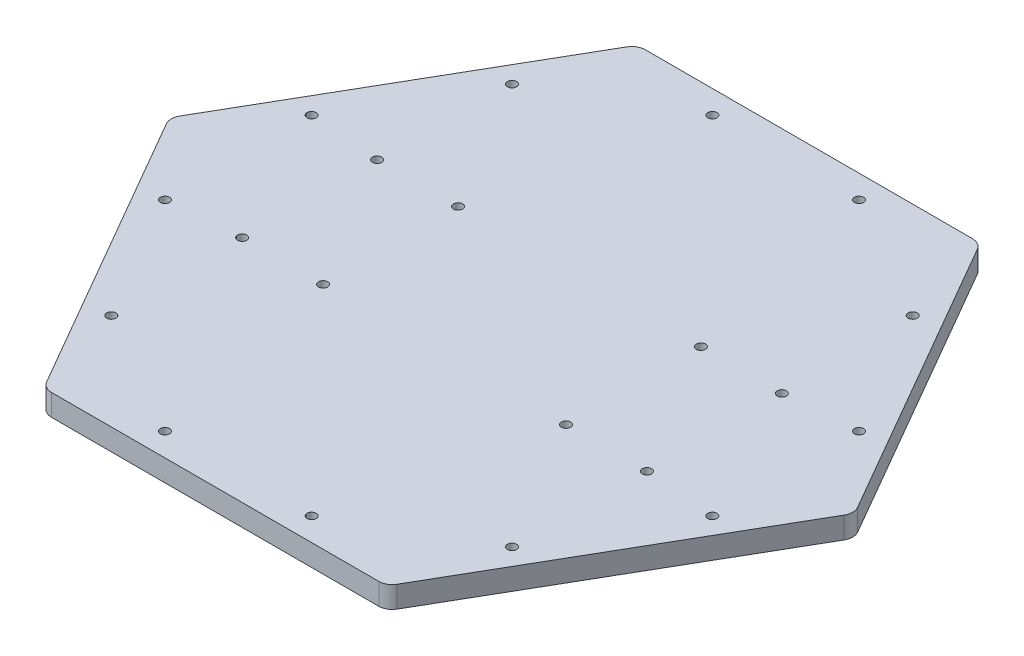
ISO-10303-21;
HEADER;
FILE_DESCRIPTION(('STEP AP214'),'2;1');
FILE_NAME('part.step','',(''),(''),'','','');
FILE_SCHEMA(('AUTOMOTIVE_DESIGN { 1 0 10303 214 1 1 1 1 }'));
ENDSEC;
DATA;
#1=APPLICATION_CONTEXT('core data for automotive mechanical design processes');
#2=APPLICATION_PROTOCOL_DEFINITION('international standard','automotive_design',2000,#1);
#3=PRODUCT_CONTEXT('',#1,'mechanical');
#4=PRODUCT('Part','Part','',(#3));
#5=PRODUCT_RELATED_PRODUCT_CATEGORY('part','',(#4));
#6=PRODUCT_DEFINITION_FORMATION('','',#4);
#7=PRODUCT_DEFINITION_CONTEXT('part definition',#1,'design');
#8=PRODUCT_DEFINITION('design','',#6,#7);
#9=PRODUCT_DEFINITION_SHAPE('','',#8);
#10=(LENGTH_UNIT() NAMED_UNIT(*) SI_UNIT(.MILLI.,.METRE.));
#11=(NAMED_UNIT(*) PLANE_ANGLE_UNIT() SI_UNIT($,.RADIAN.));
#12=(NAMED_UNIT(*) SI_UNIT($,.STERADIAN.) SOLID_ANGLE_UNIT());
#13=UNCERTAINTY_MEASURE_WITH_UNIT(LENGTH_MEASURE(1.E-05),#10,'distance_accuracy_value','');
#14=(GEOMETRIC_REPRESENTATION_CONTEXT(3) GLOBAL_UNCERTAINTY_ASSIGNED_CONTEXT((#13)) GLOBAL_UNIT_ASSIGNED_CONTEXT((#10,
#11,#12)) REPRESENTATION_CONTEXT('',''));
#15=CARTESIAN_POINT('',(0.,0.,0.));
#16=DIRECTION('',(0.,0.,1.));
#17=DIRECTION('',(1.,0.,0.));
#18=AXIS2_PLACEMENT_3D('',#15,#16,#17);
#19=CARTESIAN_POINT('',(63.5085296108598,-8.,109.999999999999));
#20=DIRECTION('',(0.866025403784442,0.,0.499999999999995));
#21=DIRECTION('',(0.499999999999995,0.,-0.866025403784442));
#22=AXIS2_PLACEMENT_3D('',#19,#20,#21);
#23=PLANE('',#22);
#24=DIRECTION('',(0.499999999999995,0.,-0.866025403784442));
#25=VECTOR('',#24,1.);
#26=CARTESIAN_POINT('',(63.5085296108598,-8.,109.999999999999));
#27=LINE('',#26,#25);
#28=CARTESIAN_POINT('',(64.9519052838338,-8.,107.499999999999));
#29=VERTEX_POINT('',#28);
#30=CARTESIAN_POINT('',(125.573683548743,-8.,2.49999999999996));
#31=VERTEX_POINT('',#30);
#32=EDGE_CURVE('E222',#29,#31,#27,.T.);
#33=ORIENTED_EDGE('',*,*,#32,.T.);
#34=DIRECTION('',(0.,1.,0.));
#35=VECTOR('',#34,1.);
#36=CARTESIAN_POINT('',(125.573683548743,-8.,2.49999999999996));
#37=LINE('',#36,#35);
#38=CARTESIAN_POINT('',(125.573683548743,0.,2.49999999999996));
#39=VERTEX_POINT('',#38);
#40=EDGE_CURVE('E143',#31,#39,#37,.T.);
#41=ORIENTED_EDGE('',*,*,#40,.T.);
#42=DIRECTION('',(0.499999999999995,0.,-0.866025403784442));
#43=VECTOR('',#42,1.);
#44=CARTESIAN_POINT('',(63.5085296108598,0.,109.999999999999));
#45=LINE('',#44,#43);
#46=CARTESIAN_POINT('',(64.9519052838338,0.,107.499999999999));
#47=VERTEX_POINT('',#46);
#48=EDGE_CURVE('E135',#47,#39,#45,.T.);
#49=ORIENTED_EDGE('',*,*,#48,.F.);
#50=DIRECTION('',(0.,1.,0.));
#51=VECTOR('',#50,1.);
#52=CARTESIAN_POINT('',(64.9519052838338,-8.,107.499999999999));
#53=LINE('',#52,#51);
#54=EDGE_CURVE('E148',#47,#29,#53,.F.);
#55=ORIENTED_EDGE('',*,*,#54,.T.);
#56=EDGE_LOOP('',(#33,#41,#49,#55));
#57=FACE_BOUND('',#56,.T.);
#58=ADVANCED_FACE('F42',(#57),#23,.T.);
#59=CARTESIAN_POINT('',(-63.5085296108575,-8.,110.));
#60=DIRECTION('',(0.,0.,1.));
#61=DIRECTION('',(1.,0.,0.));
#62=AXIS2_PLACEMENT_3D('',#59,#60,#61);
#63=PLANE('',#62);
#64=DIRECTION('',(1.,0.,0.));
#65=VECTOR('',#64,1.);
#66=CARTESIAN_POINT('',(-63.5085296108575,0.,110.));
#67=LINE('',#66,#65);
#68=CARTESIAN_POINT('',(-60.6217782649093,0.,110.));
#69=VERTEX_POINT('',#68);
#70=CARTESIAN_POINT('',(60.6217782649117,0.,109.999999999999));
#71=VERTEX_POINT('',#70);
#72=EDGE_CURVE('E137',#69,#71,#67,.T.);
#73=ORIENTED_EDGE('',*,*,#72,.F.);
#74=DIRECTION('',(0.,1.,0.));
#75=VECTOR('',#74,1.);
#76=CARTESIAN_POINT('',(-60.6217782649093,-8.,110.));
#77=LINE('',#76,#75);
#78=CARTESIAN_POINT('',(-60.6217782649093,-8.,110.));
#79=VERTEX_POINT('',#78);
#80=EDGE_CURVE('E11',#69,#79,#77,.F.);
#81=ORIENTED_EDGE('',*,*,#80,.T.);
#82=DIRECTION('',(1.,0.,0.));
#83=VECTOR('',#82,1.);
#84=CARTESIAN_POINT('',(-63.5085296108575,-8.,110.));
#85=LINE('',#84,#83);
#86=CARTESIAN_POINT('',(60.6217782649117,-8.,109.999999999999));
#87=VERTEX_POINT('',#86);
#88=EDGE_CURVE('E156',#79,#87,#85,.T.);
#89=ORIENTED_EDGE('',*,*,#88,.T.);
#90=DIRECTION('',(0.,1.,0.));
#91=VECTOR('',#90,1.);
#92=CARTESIAN_POINT('',(60.6217782649117,-8.,109.999999999999));
#93=LINE('',#92,#91);
#94=EDGE_CURVE('E50',#87,#71,#93,.T.);
#95=ORIENTED_EDGE('',*,*,#94,.T.);
#96=EDGE_LOOP('',(#73,#81,#89,#95));
#97=FACE_BOUND('',#96,.T.);
#98=ADVANCED_FACE('F203',(#97),#63,.T.);
#99=CARTESIAN_POINT('',(-127.017059221717,-8.,8.86955383974716E-13));
#100=DIRECTION('',(-0.866025403784435,0.,0.500000000000007));
#101=DIRECTION('',(0.500000000000007,0.,0.866025403784434));
#102=AXIS2_PLACEMENT_3D('',#99,#100,#101);
#103=PLANE('',#102);
#104=DIRECTION('',(0.500000000000007,0.,0.866025403784435));
#105=VECTOR('',#104,1.);
#106=CARTESIAN_POINT('',(-127.017059221717,0.,8.86955383974716E-13));
#107=LINE('',#106,#105);
#108=CARTESIAN_POINT('',(-125.573683548743,0.,2.50000000000088));
#109=VERTEX_POINT('',#108);
#110=CARTESIAN_POINT('',(-64.9519052838316,0.,107.5));
#111=VERTEX_POINT('',#110);
#112=EDGE_CURVE('E218',#109,#111,#107,.T.);
#113=ORIENTED_EDGE('',*,*,#112,.F.);
#114=DIRECTION('',(0.,1.,0.));
#115=VECTOR('',#114,1.);
#116=CARTESIAN_POINT('',(-125.573683548743,-8.,2.50000000000088));
#117=LINE('',#116,#115);
#118=CARTESIAN_POINT('',(-125.573683548743,-8.,2.50000000000088));
#119=VERTEX_POINT('',#118);
#120=EDGE_CURVE('E201',#109,#119,#117,.F.);
#121=ORIENTED_EDGE('',*,*,#120,.T.);
#122=DIRECTION('',(0.500000000000007,0.,0.866025403784435));
#123=VECTOR('',#122,1.);
#124=CARTESIAN_POINT('',(-127.017059221717,-8.,8.86955383974716E-13));
#125=LINE('',#124,#123);
#126=CARTESIAN_POINT('',(-64.9519052838316,-8.,107.5));
#127=VERTEX_POINT('',#126);
#128=EDGE_CURVE('E160',#119,#127,#125,.T.);
#129=ORIENTED_EDGE('',*,*,#128,.T.);
#130=DIRECTION('',(0.,1.,0.));
#131=VECTOR('',#130,1.);
#132=CARTESIAN_POINT('',(-64.9519052838316,-8.,107.5));
#133=LINE('',#132,#131);
#134=EDGE_CURVE('E198',#127,#111,#133,.T.);
#135=ORIENTED_EDGE('',*,*,#134,.T.);
#136=EDGE_LOOP('',(#113,#121,#129,#135));
#137=FACE_BOUND('',#136,.T.);
#138=ADVANCED_FACE('F217',(#137),#103,.T.);
#139=CARTESIAN_POINT('',(-63.508529610859,-8.,-109.999999999999));
#140=DIRECTION('',(-0.866025403784442,0.,-0.499999999999995));
#141=DIRECTION('',(-0.499999999999995,0.,0.866025403784442));
#142=AXIS2_PLACEMENT_3D('',#139,#140,#141);
#143=PLANE('',#142);
#144=DIRECTION('',(-0.499999999999995,0.,0.866025403784442));
#145=VECTOR('',#144,1.);
#146=CARTESIAN_POINT('',(-63.508529610859,0.,-109.999999999999));
#147=LINE('',#146,#145);
#148=CARTESIAN_POINT('',(-64.9519052838331,0.,-107.499999999999));
#149=VERTEX_POINT('',#148);
#150=CARTESIAN_POINT('',(-125.573683548743,0.,-2.49999999999911));
#151=VERTEX_POINT('',#150);
#152=EDGE_CURVE('E221',#149,#151,#147,.T.);
#153=ORIENTED_EDGE('',*,*,#152,.F.);
#154=DIRECTION('',(0.,1.,0.));
#155=VECTOR('',#154,1.);
#156=CARTESIAN_POINT('',(-64.9519052838331,-8.,-107.499999999999));
#157=LINE('',#156,#155);
#158=CARTESIAN_POINT('',(-64.9519052838331,-8.,-107.499999999999));
#159=VERTEX_POINT('',#158);
#160=EDGE_CURVE('E196',#149,#159,#157,.F.);
#161=ORIENTED_EDGE('',*,*,#160,.T.);
#162=DIRECTION('',(-0.499999999999995,0.,0.866025403784442));
#163=VECTOR('',#162,1.);
#164=CARTESIAN_POINT('',(-63.508529610859,-8.,-109.999999999999));
#165=LINE('',#164,#163);
#166=CARTESIAN_POINT('',(-125.573683548743,-8.,-2.49999999999911));
#167=VERTEX_POINT('',#166);
#168=EDGE_CURVE('E231',#159,#167,#165,.T.);
#169=ORIENTED_EDGE('',*,*,#168,.T.);
#170=DIRECTION('',(0.,1.,0.));
#171=VECTOR('',#170,1.);
#172=CARTESIAN_POINT('',(-125.573683548743,-8.,-2.49999999999914));
#173=LINE('',#172,#171);
#174=EDGE_CURVE('E193',#167,#151,#173,.T.);
#175=ORIENTED_EDGE('',*,*,#174,.T.);
#176=EDGE_LOOP('',(#153,#161,#169,#175));
#177=FACE_BOUND('',#176,.T.);
#178=ADVANCED_FACE('F721',(#177),#143,.T.);
#179=CARTESIAN_POINT('',(63.5085296108582,-8.,-110.));
#180=DIRECTION('',(0.,0.,-1.));
#181=DIRECTION('',(-1.,0.,0.));
#182=AXIS2_PLACEMENT_3D('',#179,#180,#181);
#183=PLANE('',#182);
#184=DIRECTION('',(-1.,0.,0.));
#185=VECTOR('',#184,1.);
#186=CARTESIAN_POINT('',(63.5085296108582,0.,-110.));
#187=LINE('',#186,#185);
#188=CARTESIAN_POINT('',(60.6217782649101,0.,-110.));
#189=VERTEX_POINT('',#188);
#190=CARTESIAN_POINT('',(-60.6217782649109,0.,-109.999999999999));
#191=VERTEX_POINT('',#190);
#192=EDGE_CURVE('E223',#189,#191,#187,.T.);
#193=ORIENTED_EDGE('',*,*,#192,.F.);
#194=DIRECTION('',(0.,1.,0.));
#195=VECTOR('',#194,1.);
#196=CARTESIAN_POINT('',(60.6217782649101,-8.,-110.));
#197=LINE('',#196,#195);
#198=CARTESIAN_POINT('',(60.6217782649101,-8.,-110.));
#199=VERTEX_POINT('',#198);
#200=EDGE_CURVE('E64',#189,#199,#197,.F.);
#201=ORIENTED_EDGE('',*,*,#200,.T.);
#202=DIRECTION('',(-1.,0.,0.));
#203=VECTOR('',#202,1.);
#204=CARTESIAN_POINT('',(63.5085296108582,-8.,-110.));
#205=LINE('',#204,#203);
#206=CARTESIAN_POINT('',(-60.6217782649109,-8.,-109.999999999999));
#207=VERTEX_POINT('',#206);
#208=EDGE_CURVE('E234',#199,#207,#205,.T.);
#209=ORIENTED_EDGE('',*,*,#208,.T.);
#210=DIRECTION('',(0.,1.,0.));
#211=VECTOR('',#210,1.);
#212=CARTESIAN_POINT('',(-60.6217782649109,-8.,-109.999999999999));
#213=LINE('',#212,#211);
#214=EDGE_CURVE('E189',#207,#191,#213,.T.);
#215=ORIENTED_EDGE('',*,*,#214,.T.);
#216=EDGE_LOOP('',(#193,#201,#209,#215));
#217=FACE_BOUND('',#216,.T.);
#218=ADVANCED_FACE('F711',(#217),#183,.T.);
#219=CARTESIAN_POINT('',(127.017059221717,-8.,0.));
#220=DIRECTION('',(0.866025403784438,0.,-0.500000000000001));
#221=DIRECTION('',(-0.500000000000001,0.,-0.866025403784438));
#222=AXIS2_PLACEMENT_3D('',#219,#220,#221);
#223=PLANE('',#222);
#224=DIRECTION('',(-0.500000000000001,0.,-0.866025403784438));
#225=VECTOR('',#224,1.);
#226=CARTESIAN_POINT('',(127.017059221717,0.,0.));
#227=LINE('',#226,#225);
#228=CARTESIAN_POINT('',(125.573683548743,0.,-2.5));
#229=VERTEX_POINT('',#228);
#230=CARTESIAN_POINT('',(64.9519052838323,0.,-107.5));
#231=VERTEX_POINT('',#230);
#232=EDGE_CURVE('E151',#229,#231,#227,.T.);
#233=ORIENTED_EDGE('',*,*,#232,.F.);
#234=DIRECTION('',(0.,1.,0.));
#235=VECTOR('',#234,1.);
#236=CARTESIAN_POINT('',(125.573683548743,-8.,-2.5));
#237=LINE('',#236,#235);
#238=CARTESIAN_POINT('',(125.573683548743,-8.,-2.5));
#239=VERTEX_POINT('',#238);
#240=EDGE_CURVE('E177',#229,#239,#237,.F.);
#241=ORIENTED_EDGE('',*,*,#240,.T.);
#242=DIRECTION('',(-0.500000000000001,0.,-0.866025403784438));
#243=VECTOR('',#242,1.);
#244=CARTESIAN_POINT('',(127.017059221717,-8.,0.));
#245=LINE('',#244,#243);
#246=CARTESIAN_POINT('',(64.9519052838323,-8.,-107.5));
#247=VERTEX_POINT('',#246);
#248=EDGE_CURVE('E236',#239,#247,#245,.T.);
#249=ORIENTED_EDGE('',*,*,#248,.T.);
#250=DIRECTION('',(0.,1.,0.));
#251=VECTOR('',#250,1.);
#252=CARTESIAN_POINT('',(64.9519052838323,-8.,-107.5));
#253=LINE('',#252,#251);
#254=EDGE_CURVE('E174',#247,#231,#253,.T.);
#255=ORIENTED_EDGE('',*,*,#254,.T.);
#256=EDGE_LOOP('',(#233,#241,#249,#255));
#257=FACE_BOUND('',#256,.T.);
#258=ADVANCED_FACE('F432',(#257),#223,.T.);
#259=CARTESIAN_POINT('',(0.,-8.,0.));
#260=DIRECTION('',(0.,1.,0.));
#261=DIRECTION('',(0.,0.,1.));
#262=AXIS2_PLACEMENT_3D('',#259,#260,#261);
#263=PLANE('',#262);
#264=CARTESIAN_POINT('',(-27.175999735766,-8.,101.422211760352));
#265=DIRECTION('',(0.,1.,0.));
#266=DIRECTION('',(0.,0.,1.));
#267=AXIS2_PLACEMENT_3D('',#264,#265,#266);
#268=CIRCLE('',#267,1.7);
#269=CARTESIAN_POINT('',(-27.175999735766,-8.,103.122211760352));
#270=VERTEX_POINT('',#269);
#271=EDGE_CURVE('E351',#270,#270,#268,.T.);
#272=ORIENTED_EDGE('',*,*,#271,.T.);
#273=EDGE_LOOP('',(#272));
#274=FACE_BOUND('',#273,.T.);
#275=CARTESIAN_POINT('',(27.1759997357634,-8.,101.422211760352));
#276=DIRECTION('',(0.,1.,0.));
#277=DIRECTION('',(0.,0.,1.));
#278=AXIS2_PLACEMENT_3D('',#275,#276,#277);
#279=CIRCLE('',#278,1.70000000000001);
#280=CARTESIAN_POINT('',(27.1759997357634,-8.,103.122211760352));
#281=VERTEX_POINT('',#280);
#282=EDGE_CURVE('E345',#281,#281,#279,.T.);
#283=ORIENTED_EDGE('',*,*,#282,.T.);
#284=EDGE_LOOP('',(#283));
#285=FACE_BOUND('',#284,.T.);
#286=CARTESIAN_POINT('',(74.2462120245867,-8.,74.2462120245883));
#287=DIRECTION('',(0.,1.,0.));
#288=DIRECTION('',(0.,0.,1.));
#289=AXIS2_PLACEMENT_3D('',#286,#287,#288);
#290=CIRCLE('',#289,1.70000000000001);
#291=CARTESIAN_POINT('',(74.2462120245867,-8.,75.9462120245883));
#292=VERTEX_POINT('',#291);
#293=EDGE_CURVE('E339',#292,#292,#290,.T.);
#294=ORIENTED_EDGE('',*,*,#293,.T.);
#295=EDGE_LOOP('',(#294));
#296=FACE_BOUND('',#295,.T.);
#297=CARTESIAN_POINT('',(101.422211760352,-8.,27.1759997357657));
#298=DIRECTION('',(0.,1.,0.));
#299=DIRECTION('',(0.,0.,1.));
#300=AXIS2_PLACEMENT_3D('',#297,#298,#299);
#301=CIRCLE('',#300,1.70000000000001);
#302=CARTESIAN_POINT('',(101.422211760352,-8.,28.8759997357657));
#303=VERTEX_POINT('',#302);
#304=EDGE_CURVE('E333',#303,#303,#301,.T.);
#305=ORIENTED_EDGE('',*,*,#304,.T.);
#306=EDGE_LOOP('',(#305));
#307=FACE_BOUND('',#306,.T.);
#308=CARTESIAN_POINT('',(101.422211760352,-8.,-27.1759997357638));
#309=DIRECTION('',(0.,1.,0.));
#310=DIRECTION('',(0.,0.,1.));
#311=AXIS2_PLACEMENT_3D('',#308,#309,#310);
#312=CIRCLE('',#311,1.70000000000002);
#313=CARTESIAN_POINT('',(101.422211760352,-8.,-25.4759997357638));
#314=VERTEX_POINT('',#313);
#315=EDGE_CURVE('E327',#314,#314,#312,.T.);
#316=ORIENTED_EDGE('',*,*,#315,.T.);
#317=EDGE_LOOP('',(#316));
#318=FACE_BOUND('',#317,.T.);
#319=CARTESIAN_POINT('',(74.2462120245881,-8.,-74.246212024587));
#320=DIRECTION('',(0.,1.,0.));
#321=DIRECTION('',(0.,0.,1.));
#322=AXIS2_PLACEMENT_3D('',#319,#320,#321);
#323=CIRCLE('',#322,1.70000000000001);
#324=CARTESIAN_POINT('',(74.2462120245881,-8.,-72.5462120245869));
#325=VERTEX_POINT('',#324);
#326=EDGE_CURVE('E321',#325,#325,#323,.T.);
#327=ORIENTED_EDGE('',*,*,#326,.T.);
#328=EDGE_LOOP('',(#327));
#329=FACE_BOUND('',#328,.T.);
#330=CARTESIAN_POINT('',(27.1759997357653,-8.,-101.422211760352));
#331=DIRECTION('',(0.,1.,0.));
#332=DIRECTION('',(0.,0.,1.));
#333=AXIS2_PLACEMENT_3D('',#330,#331,#332);
#334=CIRCLE('',#333,1.70000000000001);
#335=CARTESIAN_POINT('',(27.1759997357653,-8.,-99.722211760352));
#336=VERTEX_POINT('',#335);
#337=EDGE_CURVE('E315',#336,#336,#334,.T.);
#338=ORIENTED_EDGE('',*,*,#337,.T.);
#339=EDGE_LOOP('',(#338));
#340=FACE_BOUND('',#339,.T.);
#341=CARTESIAN_POINT('',(-27.1759997357642,-8.,-101.422211760352));
#342=DIRECTION('',(0.,1.,0.));
#343=DIRECTION('',(0.,0.,1.));
#344=AXIS2_PLACEMENT_3D('',#341,#342,#343);
#345=CIRCLE('',#344,1.70000000000002);
#346=CARTESIAN_POINT('',(-27.1759997357642,-8.,-99.7222117603523));
#347=VERTEX_POINT('',#346);
#348=EDGE_CURVE('E309',#347,#347,#345,.T.);
#349=ORIENTED_EDGE('',*,*,#348,.T.);
#350=EDGE_LOOP('',(#349));
#351=FACE_BOUND('',#350,.T.);
#352=CARTESIAN_POINT('',(-74.2462120245872,-8.,-74.2462120245878));
#353=DIRECTION('',(0.,1.,0.));
#354=DIRECTION('',(0.,0.,1.));
#355=AXIS2_PLACEMENT_3D('',#352,#353,#354);
#356=CIRCLE('',#355,1.70000000000001);
#357=CARTESIAN_POINT('',(-74.2462120245872,-8.,-72.5462120245878));
#358=VERTEX_POINT('',#357);
#359=EDGE_CURVE('E303',#358,#358,#356,.T.);
#360=ORIENTED_EDGE('',*,*,#359,.T.);
#361=EDGE_LOOP('',(#360));
#362=FACE_BOUND('',#361,.T.);
#363=CARTESIAN_POINT('',(-101.422211760352,-8.,-27.175999735765));
#364=DIRECTION('',(0.,1.,0.));
#365=DIRECTION('',(0.,0.,1.));
#366=AXIS2_PLACEMENT_3D('',#363,#364,#365);
#367=CIRCLE('',#366,1.70000000000002);
#368=CARTESIAN_POINT('',(-101.422211760352,-8.,-25.475999735765));
#369=VERTEX_POINT('',#368);
#370=EDGE_CURVE('E297',#369,#369,#367,.T.);
#371=ORIENTED_EDGE('',*,*,#370,.T.);
#372=EDGE_LOOP('',(#371));
#373=FACE_BOUND('',#372,.T.);
#374=CARTESIAN_POINT('',(-101.422211760352,-8.,27.1759997357645));
#375=DIRECTION('',(0.,1.,0.));
#376=DIRECTION('',(0.,0.,1.));
#377=AXIS2_PLACEMENT_3D('',#374,#375,#376);
#378=CIRCLE('',#377,1.70000000000002);
#379=CARTESIAN_POINT('',(-101.422211760352,-8.,28.8759997357645));
#380=VERTEX_POINT('',#379);
#381=EDGE_CURVE('E291',#380,#380,#378,.T.);
#382=ORIENTED_EDGE('',*,*,#381,.T.);
#383=EDGE_LOOP('',(#382));
#384=FACE_BOUND('',#383,.T.);
#385=CARTESIAN_POINT('',(-74.2462120245875,-8.,74.2462120245874));
#386=DIRECTION('',(0.,1.,0.));
#387=DIRECTION('',(0.,0.,1.));
#388=AXIS2_PLACEMENT_3D('',#385,#386,#387);
#389=CIRCLE('',#388,1.70000000000001);
#390=CARTESIAN_POINT('',(-74.2462120245875,-8.,75.9462120245875));
#391=VERTEX_POINT('',#390);
#392=EDGE_CURVE('E285',#391,#391,#389,.T.);
#393=ORIENTED_EDGE('',*,*,#392,.T.);
#394=EDGE_LOOP('',(#393));
#395=FACE_BOUND('',#394,.T.);
#396=CARTESIAN_POINT('',(45.,-8.,25.));
#397=DIRECTION('',(0.,1.,0.));
#398=DIRECTION('',(0.,0.,1.));
#399=AXIS2_PLACEMENT_3D('',#396,#397,#398);
#400=CIRCLE('',#399,1.7);
#401=CARTESIAN_POINT('',(45.,-8.,26.7));
#402=VERTEX_POINT('',#401);
#403=EDGE_CURVE('E279',#402,#402,#400,.T.);
#404=ORIENTED_EDGE('',*,*,#403,.T.);
#405=EDGE_LOOP('',(#404));
#406=FACE_BOUND('',#405,.T.);
#407=CARTESIAN_POINT('',(45.,-8.,-25.));
#408=DIRECTION('',(0.,1.,0.));
#409=DIRECTION('',(0.,0.,1.));
#410=AXIS2_PLACEMENT_3D('',#407,#408,#409);
#411=CIRCLE('',#410,1.7);
#412=CARTESIAN_POINT('',(45.,-8.,-23.3));
#413=VERTEX_POINT('',#412);
#414=EDGE_CURVE('E273',#413,#413,#411,.T.);
#415=ORIENTED_EDGE('',*,*,#414,.T.);
#416=EDGE_LOOP('',(#415));
#417=FACE_BOUND('',#416,.T.);
#418=CARTESIAN_POINT('',(-45.,-8.,25.));
#419=DIRECTION('',(0.,1.,0.));
#420=DIRECTION('',(0.,0.,1.));
#421=AXIS2_PLACEMENT_3D('',#418,#419,#420);
#422=CIRCLE('',#421,1.7);
#423=CARTESIAN_POINT('',(-45.,-8.,26.7));
#424=VERTEX_POINT('',#423);
#425=EDGE_CURVE('E267',#424,#424,#422,.T.);
#426=ORIENTED_EDGE('',*,*,#425,.T.);
#427=EDGE_LOOP('',(#426));
#428=FACE_BOUND('',#427,.T.);
#429=CARTESIAN_POINT('',(-45.,-8.,-25.));
#430=DIRECTION('',(0.,1.,0.));
#431=DIRECTION('',(0.,0.,1.));
#432=AXIS2_PLACEMENT_3D('',#429,#430,#431);
#433=CIRCLE('',#432,1.7);
#434=CARTESIAN_POINT('',(-45.,-8.,-23.3));
#435=VERTEX_POINT('',#434);
#436=EDGE_CURVE('E261',#435,#435,#433,.T.);
#437=ORIENTED_EDGE('',*,*,#436,.T.);
#438=EDGE_LOOP('',(#437));
#439=FACE_BOUND('',#438,.T.);
#440=CARTESIAN_POINT('',(75.,-8.,25.));
#441=DIRECTION('',(0.,1.,0.));
#442=DIRECTION('',(0.,0.,1.));
#443=AXIS2_PLACEMENT_3D('',#440,#441,#442);
#444=CIRCLE('',#443,1.7);
#445=CARTESIAN_POINT('',(75.,-8.,26.7));
#446=VERTEX_POINT('',#445);
#447=EDGE_CURVE('E255',#446,#446,#444,.T.);
#448=ORIENTED_EDGE('',*,*,#447,.T.);
#449=EDGE_LOOP('',(#448));
#450=FACE_BOUND('',#449,.T.);
#451=CARTESIAN_POINT('',(75.,-8.,-25.));
#452=DIRECTION('',(0.,1.,0.));
#453=DIRECTION('',(0.,0.,1.));
#454=AXIS2_PLACEMENT_3D('',#451,#452,#453);
#455=CIRCLE('',#454,1.7);
#456=CARTESIAN_POINT('',(75.,-8.,-23.3));
#457=VERTEX_POINT('',#456);
#458=EDGE_CURVE('E249',#457,#457,#455,.T.);
#459=ORIENTED_EDGE('',*,*,#458,.T.);
#460=EDGE_LOOP('',(#459));
#461=FACE_BOUND('',#460,.T.);
#462=CARTESIAN_POINT('',(-75.,-8.,25.));
#463=DIRECTION('',(0.,1.,0.));
#464=DIRECTION('',(0.,0.,1.));
#465=AXIS2_PLACEMENT_3D('',#462,#463,#464);
#466=CIRCLE('',#465,1.7);
#467=CARTESIAN_POINT('',(-75.,-8.,26.7));
#468=VERTEX_POINT('',#467);
#469=EDGE_CURVE('E243',#468,#468,#466,.T.);
#470=ORIENTED_EDGE('',*,*,#469,.T.);
#471=EDGE_LOOP('',(#470));
#472=FACE_BOUND('',#471,.T.);
#473=CARTESIAN_POINT('',(-75.,-8.,-25.));
#474=DIRECTION('',(0.,1.,0.));
#475=DIRECTION('',(0.,0.,1.));
#476=AXIS2_PLACEMENT_3D('',#473,#474,#475);
#477=CIRCLE('',#476,1.7);
#478=CARTESIAN_POINT('',(-75.,-8.,-23.3));
#479=VERTEX_POINT('',#478);
#480=EDGE_CURVE('E152',#479,#479,#477,.T.);
#481=ORIENTED_EDGE('',*,*,#480,.T.);
#482=EDGE_LOOP('',(#481));
#483=FACE_BOUND('',#482,.T.);
#484=ORIENTED_EDGE('',*,*,#248,.F.);
#485=CARTESIAN_POINT('',(121.243556529821,-8.,0.));
#486=DIRECTION('',(0.,1.,0.));
#487=DIRECTION('',(0.,0.,1.));
#488=AXIS2_PLACEMENT_3D('',#485,#486,#487);
#489=CIRCLE('',#488,5.);
#490=EDGE_CURVE('E187',#239,#31,#489,.F.);
#491=ORIENTED_EDGE('',*,*,#490,.T.);
#492=ORIENTED_EDGE('',*,*,#32,.F.);
#493=CARTESIAN_POINT('',(60.6217782649116,-8.,104.999999999999));
#494=DIRECTION('',(0.,1.,0.));
#495=DIRECTION('',(0.,0.,1.));
#496=AXIS2_PLACEMENT_3D('',#493,#494,#495);
#497=CIRCLE('',#496,5.);
#498=EDGE_CURVE('E155',#29,#87,#497,.F.);
#499=ORIENTED_EDGE('',*,*,#498,.T.);
#500=ORIENTED_EDGE('',*,*,#88,.F.);
#501=CARTESIAN_POINT('',(-60.6217782649094,-8.,105.));
#502=DIRECTION('',(0.,1.,0.));
#503=DIRECTION('',(0.,0.,1.));
#504=AXIS2_PLACEMENT_3D('',#501,#502,#503);
#505=CIRCLE('',#504,5.);
#506=EDGE_CURVE('E180',#79,#127,#505,.F.);
#507=ORIENTED_EDGE('',*,*,#506,.T.);
#508=ORIENTED_EDGE('',*,*,#128,.F.);
#509=CARTESIAN_POINT('',(-121.243556529821,-8.,8.46545056276682E-13));
#510=DIRECTION('',(0.,1.,0.));
#511=DIRECTION('',(0.,0.,1.));
#512=AXIS2_PLACEMENT_3D('',#509,#510,#511);
#513=CIRCLE('',#512,5.);
#514=EDGE_CURVE('E182',#119,#167,#513,.F.);
#515=ORIENTED_EDGE('',*,*,#514,.T.);
#516=ORIENTED_EDGE('',*,*,#168,.F.);
#517=CARTESIAN_POINT('',(-60.6217782649109,-8.,-104.999999999999));
#518=DIRECTION('',(0.,1.,0.));
#519=DIRECTION('',(0.,0.,1.));
#520=AXIS2_PLACEMENT_3D('',#517,#518,#519);
#521=CIRCLE('',#520,5.);
#522=EDGE_CURVE('E57',#159,#207,#521,.F.);
#523=ORIENTED_EDGE('',*,*,#522,.T.);
#524=ORIENTED_EDGE('',*,*,#208,.F.);
#525=CARTESIAN_POINT('',(60.6217782649101,-8.,-105.));
#526=DIRECTION('',(0.,1.,0.));
#527=DIRECTION('',(0.,0.,1.));
#528=AXIS2_PLACEMENT_3D('',#525,#526,#527);
#529=CIRCLE('',#528,5.);
#530=EDGE_CURVE('E185',#199,#247,#529,.F.);
#531=ORIENTED_EDGE('',*,*,#530,.T.);
#532=EDGE_LOOP('',(#484,#491,#492,#499,#500,#507,#508,#515,#516,#523,#524,#531));
#533=FACE_BOUND('',#532,.T.);
#534=ADVANCED_FACE('F208',(#274,#285,#296,#307,#318,#329,#340,#351,#362,#373,#384,#395,#406,
#417,#428,#439,#450,#461,#472,#483,#533),#263,.F.);
#535=CARTESIAN_POINT('',(0.,0.,0.));
#536=DIRECTION('',(0.,1.,0.));
#537=DIRECTION('',(0.,0.,1.));
#538=AXIS2_PLACEMENT_3D('',#535,#536,#537);
#539=PLANE('',#538);
#540=CARTESIAN_POINT('',(-27.175999735766,0.,101.422211760352));
#541=DIRECTION('',(0.,1.,0.));
#542=DIRECTION('',(0.,0.,1.));
#543=AXIS2_PLACEMENT_3D('',#540,#541,#542);
#544=CIRCLE('',#543,1.7);
#545=CARTESIAN_POINT('',(-27.175999735766,0.,103.122211760352));
#546=VERTEX_POINT('',#545);
#547=EDGE_CURVE('E354',#546,#546,#544,.T.);
#548=ORIENTED_EDGE('',*,*,#547,.F.);
#549=EDGE_LOOP('',(#548));
#550=FACE_BOUND('',#549,.T.);
#551=CARTESIAN_POINT('',(27.1759997357634,0.,101.422211760352));
#552=DIRECTION('',(0.,1.,0.));
#553=DIRECTION('',(0.,0.,1.));
#554=AXIS2_PLACEMENT_3D('',#551,#552,#553);
#555=CIRCLE('',#554,1.70000000000001);
#556=CARTESIAN_POINT('',(27.1759997357634,0.,103.122211760352));
#557=VERTEX_POINT('',#556);
#558=EDGE_CURVE('E348',#557,#557,#555,.T.);
#559=ORIENTED_EDGE('',*,*,#558,.F.);
#560=EDGE_LOOP('',(#559));
#561=FACE_BOUND('',#560,.T.);
#562=CARTESIAN_POINT('',(74.2462120245867,0.,74.2462120245883));
#563=DIRECTION('',(0.,1.,0.));
#564=DIRECTION('',(0.,0.,1.));
#565=AXIS2_PLACEMENT_3D('',#562,#563,#564);
#566=CIRCLE('',#565,1.70000000000001);
#567=CARTESIAN_POINT('',(74.2462120245867,0.,75.9462120245883));
#568=VERTEX_POINT('',#567);
#569=EDGE_CURVE('E342',#568,#568,#566,.T.);
#570=ORIENTED_EDGE('',*,*,#569,.F.);
#571=EDGE_LOOP('',(#570));
#572=FACE_BOUND('',#571,.T.);
#573=CARTESIAN_POINT('',(101.422211760352,0.,27.1759997357657));
#574=DIRECTION('',(0.,1.,0.));
#575=DIRECTION('',(0.,0.,1.));
#576=AXIS2_PLACEMENT_3D('',#573,#574,#575);
#577=CIRCLE('',#576,1.70000000000001);
#578=CARTESIAN_POINT('',(101.422211760352,0.,28.8759997357657));
#579=VERTEX_POINT('',#578);
#580=EDGE_CURVE('E336',#579,#579,#577,.T.);
#581=ORIENTED_EDGE('',*,*,#580,.F.);
#582=EDGE_LOOP('',(#581));
#583=FACE_BOUND('',#582,.T.);
#584=CARTESIAN_POINT('',(101.422211760352,0.,-27.1759997357638));
#585=DIRECTION('',(0.,1.,0.));
#586=DIRECTION('',(0.,0.,1.));
#587=AXIS2_PLACEMENT_3D('',#584,#585,#586);
#588=CIRCLE('',#587,1.70000000000002);
#589=CARTESIAN_POINT('',(101.422211760352,0.,-25.4759997357638));
#590=VERTEX_POINT('',#589);
#591=EDGE_CURVE('E330',#590,#590,#588,.T.);
#592=ORIENTED_EDGE('',*,*,#591,.F.);
#593=EDGE_LOOP('',(#592));
#594=FACE_BOUND('',#593,.T.);
#595=CARTESIAN_POINT('',(74.2462120245881,0.,-74.246212024587));
#596=DIRECTION('',(0.,1.,0.));
#597=DIRECTION('',(0.,0.,1.));
#598=AXIS2_PLACEMENT_3D('',#595,#596,#597);
#599=CIRCLE('',#598,1.70000000000001);
#600=CARTESIAN_POINT('',(74.2462120245881,0.,-72.5462120245869));
#601=VERTEX_POINT('',#600);
#602=EDGE_CURVE('E324',#601,#601,#599,.T.);
#603=ORIENTED_EDGE('',*,*,#602,.F.);
#604=EDGE_LOOP('',(#603));
#605=FACE_BOUND('',#604,.T.);
#606=CARTESIAN_POINT('',(27.1759997357653,0.,-101.422211760352));
#607=DIRECTION('',(0.,1.,0.));
#608=DIRECTION('',(0.,0.,1.));
#609=AXIS2_PLACEMENT_3D('',#606,#607,#608);
#610=CIRCLE('',#609,1.70000000000001);
#611=CARTESIAN_POINT('',(27.1759997357653,0.,-99.722211760352));
#612=VERTEX_POINT('',#611);
#613=EDGE_CURVE('E318',#612,#612,#610,.T.);
#614=ORIENTED_EDGE('',*,*,#613,.F.);
#615=EDGE_LOOP('',(#614));
#616=FACE_BOUND('',#615,.T.);
#617=CARTESIAN_POINT('',(-27.1759997357642,0.,-101.422211760352));
#618=DIRECTION('',(0.,1.,0.));
#619=DIRECTION('',(0.,0.,1.));
#620=AXIS2_PLACEMENT_3D('',#617,#618,#619);
#621=CIRCLE('',#620,1.70000000000002);
#622=CARTESIAN_POINT('',(-27.1759997357642,0.,-99.7222117603523));
#623=VERTEX_POINT('',#622);
#624=EDGE_CURVE('E312',#623,#623,#621,.T.);
#625=ORIENTED_EDGE('',*,*,#624,.F.);
#626=EDGE_LOOP('',(#625));
#627=FACE_BOUND('',#626,.T.);
#628=CARTESIAN_POINT('',(-74.2462120245872,0.,-74.2462120245878));
#629=DIRECTION('',(0.,1.,0.));
#630=DIRECTION('',(0.,0.,1.));
#631=AXIS2_PLACEMENT_3D('',#628,#629,#630);
#632=CIRCLE('',#631,1.70000000000001);
#633=CARTESIAN_POINT('',(-74.2462120245872,0.,-72.5462120245878));
#634=VERTEX_POINT('',#633);
#635=EDGE_CURVE('E306',#634,#634,#632,.T.);
#636=ORIENTED_EDGE('',*,*,#635,.F.);
#637=EDGE_LOOP('',(#636));
#638=FACE_BOUND('',#637,.T.);
#639=CARTESIAN_POINT('',(-101.422211760352,0.,-27.175999735765));
#640=DIRECTION('',(0.,1.,0.));
#641=DIRECTION('',(0.,0.,1.));
#642=AXIS2_PLACEMENT_3D('',#639,#640,#641);
#643=CIRCLE('',#642,1.70000000000002);
#644=CARTESIAN_POINT('',(-101.422211760352,0.,-25.475999735765));
#645=VERTEX_POINT('',#644);
#646=EDGE_CURVE('E300',#645,#645,#643,.T.);
#647=ORIENTED_EDGE('',*,*,#646,.F.);
#648=EDGE_LOOP('',(#647));
#649=FACE_BOUND('',#648,.T.);
#650=CARTESIAN_POINT('',(-101.422211760352,0.,27.1759997357645));
#651=DIRECTION('',(0.,1.,0.));
#652=DIRECTION('',(0.,0.,1.));
#653=AXIS2_PLACEMENT_3D('',#650,#651,#652);
#654=CIRCLE('',#653,1.70000000000002);
#655=CARTESIAN_POINT('',(-101.422211760352,0.,28.8759997357645));
#656=VERTEX_POINT('',#655);
#657=EDGE_CURVE('E294',#656,#656,#654,.T.);
#658=ORIENTED_EDGE('',*,*,#657,.F.);
#659=EDGE_LOOP('',(#658));
#660=FACE_BOUND('',#659,.T.);
#661=CARTESIAN_POINT('',(-74.2462120245875,0.,74.2462120245874));
#662=DIRECTION('',(0.,1.,0.));
#663=DIRECTION('',(0.,0.,1.));
#664=AXIS2_PLACEMENT_3D('',#661,#662,#663);
#665=CIRCLE('',#664,1.70000000000001);
#666=CARTESIAN_POINT('',(-74.2462120245875,0.,75.9462120245875));
#667=VERTEX_POINT('',#666);
#668=EDGE_CURVE('E288',#667,#667,#665,.T.);
#669=ORIENTED_EDGE('',*,*,#668,.F.);
#670=EDGE_LOOP('',(#669));
#671=FACE_BOUND('',#670,.T.);
#672=CARTESIAN_POINT('',(45.,0.,25.));
#673=DIRECTION('',(0.,1.,0.));
#674=DIRECTION('',(0.,0.,1.));
#675=AXIS2_PLACEMENT_3D('',#672,#673,#674);
#676=CIRCLE('',#675,1.7);
#677=CARTESIAN_POINT('',(45.,0.,26.7));
#678=VERTEX_POINT('',#677);
#679=EDGE_CURVE('E282',#678,#678,#676,.T.);
#680=ORIENTED_EDGE('',*,*,#679,.F.);
#681=EDGE_LOOP('',(#680));
#682=FACE_BOUND('',#681,.T.);
#683=CARTESIAN_POINT('',(45.,0.,-25.));
#684=DIRECTION('',(0.,1.,0.));
#685=DIRECTION('',(0.,0.,1.));
#686=AXIS2_PLACEMENT_3D('',#683,#684,#685);
#687=CIRCLE('',#686,1.7);
#688=CARTESIAN_POINT('',(45.,0.,-23.3));
#689=VERTEX_POINT('',#688);
#690=EDGE_CURVE('E276',#689,#689,#687,.T.);
#691=ORIENTED_EDGE('',*,*,#690,.F.);
#692=EDGE_LOOP('',(#691));
#693=FACE_BOUND('',#692,.T.);
#694=CARTESIAN_POINT('',(-45.,0.,25.));
#695=DIRECTION('',(0.,1.,0.));
#696=DIRECTION('',(0.,0.,1.));
#697=AXIS2_PLACEMENT_3D('',#694,#695,#696);
#698=CIRCLE('',#697,1.7);
#699=CARTESIAN_POINT('',(-45.,0.,26.7));
#700=VERTEX_POINT('',#699);
#701=EDGE_CURVE('E270',#700,#700,#698,.T.);
#702=ORIENTED_EDGE('',*,*,#701,.F.);
#703=EDGE_LOOP('',(#702));
#704=FACE_BOUND('',#703,.T.);
#705=CARTESIAN_POINT('',(-45.,0.,-25.));
#706=DIRECTION('',(0.,1.,0.));
#707=DIRECTION('',(0.,0.,1.));
#708=AXIS2_PLACEMENT_3D('',#705,#706,#707);
#709=CIRCLE('',#708,1.7);
#710=CARTESIAN_POINT('',(-45.,0.,-23.3));
#711=VERTEX_POINT('',#710);
#712=EDGE_CURVE('E264',#711,#711,#709,.T.);
#713=ORIENTED_EDGE('',*,*,#712,.F.);
#714=EDGE_LOOP('',(#713));
#715=FACE_BOUND('',#714,.T.);
#716=CARTESIAN_POINT('',(75.,0.,25.));
#717=DIRECTION('',(0.,1.,0.));
#718=DIRECTION('',(0.,0.,1.));
#719=AXIS2_PLACEMENT_3D('',#716,#717,#718);
#720=CIRCLE('',#719,1.7);
#721=CARTESIAN_POINT('',(75.,0.,26.7));
#722=VERTEX_POINT('',#721);
#723=EDGE_CURVE('E258',#722,#722,#720,.T.);
#724=ORIENTED_EDGE('',*,*,#723,.F.);
#725=EDGE_LOOP('',(#724));
#726=FACE_BOUND('',#725,.T.);
#727=CARTESIAN_POINT('',(75.,0.,-25.));
#728=DIRECTION('',(0.,1.,0.));
#729=DIRECTION('',(0.,0.,1.));
#730=AXIS2_PLACEMENT_3D('',#727,#728,#729);
#731=CIRCLE('',#730,1.7);
#732=CARTESIAN_POINT('',(75.,0.,-23.3));
#733=VERTEX_POINT('',#732);
#734=EDGE_CURVE('E252',#733,#733,#731,.T.);
#735=ORIENTED_EDGE('',*,*,#734,.F.);
#736=EDGE_LOOP('',(#735));
#737=FACE_BOUND('',#736,.T.);
#738=CARTESIAN_POINT('',(-75.,0.,25.));
#739=DIRECTION('',(0.,1.,0.));
#740=DIRECTION('',(0.,0.,1.));
#741=AXIS2_PLACEMENT_3D('',#738,#739,#740);
#742=CIRCLE('',#741,1.7);
#743=CARTESIAN_POINT('',(-75.,0.,26.7));
#744=VERTEX_POINT('',#743);
#745=EDGE_CURVE('E246',#744,#744,#742,.T.);
#746=ORIENTED_EDGE('',*,*,#745,.F.);
#747=EDGE_LOOP('',(#746));
#748=FACE_BOUND('',#747,.T.);
#749=CARTESIAN_POINT('',(-75.,0.,-25.));
#750=DIRECTION('',(0.,1.,0.));
#751=DIRECTION('',(0.,0.,1.));
#752=AXIS2_PLACEMENT_3D('',#749,#750,#751);
#753=CIRCLE('',#752,1.7);
#754=CARTESIAN_POINT('',(-75.,0.,-23.3));
#755=VERTEX_POINT('',#754);
#756=EDGE_CURVE('E240',#755,#755,#753,.T.);
#757=ORIENTED_EDGE('',*,*,#756,.F.);
#758=EDGE_LOOP('',(#757));
#759=FACE_BOUND('',#758,.T.);
#760=ORIENTED_EDGE('',*,*,#48,.T.);
#761=CARTESIAN_POINT('',(121.243556529821,0.,0.));
#762=DIRECTION('',(0.,1.,0.));
#763=DIRECTION('',(0.,0.,1.));
#764=AXIS2_PLACEMENT_3D('',#761,#762,#763);
#765=CIRCLE('',#764,5.);
#766=EDGE_CURVE('E172',#39,#229,#765,.T.);
#767=ORIENTED_EDGE('',*,*,#766,.T.);
#768=ORIENTED_EDGE('',*,*,#232,.T.);
#769=CARTESIAN_POINT('',(60.6217782649101,0.,-105.));
#770=DIRECTION('',(0.,1.,0.));
#771=DIRECTION('',(0.,0.,1.));
#772=AXIS2_PLACEMENT_3D('',#769,#770,#771);
#773=CIRCLE('',#772,5.);
#774=EDGE_CURVE('E170',#231,#189,#773,.T.);
#775=ORIENTED_EDGE('',*,*,#774,.T.);
#776=ORIENTED_EDGE('',*,*,#192,.T.);
#777=CARTESIAN_POINT('',(-60.6217782649109,0.,-104.999999999999));
#778=DIRECTION('',(0.,1.,0.));
#779=DIRECTION('',(0.,0.,1.));
#780=AXIS2_PLACEMENT_3D('',#777,#778,#779);
#781=CIRCLE('',#780,5.);
#782=EDGE_CURVE('E168',#191,#149,#781,.T.);
#783=ORIENTED_EDGE('',*,*,#782,.T.);
#784=ORIENTED_EDGE('',*,*,#152,.T.);
#785=CARTESIAN_POINT('',(-121.243556529821,0.,8.46545056276682E-13));
#786=DIRECTION('',(0.,1.,0.));
#787=DIRECTION('',(0.,0.,1.));
#788=AXIS2_PLACEMENT_3D('',#785,#786,#787);
#789=CIRCLE('',#788,5.);
#790=EDGE_CURVE('E166',#151,#109,#789,.T.);
#791=ORIENTED_EDGE('',*,*,#790,.T.);
#792=ORIENTED_EDGE('',*,*,#112,.T.);
#793=CARTESIAN_POINT('',(-60.6217782649094,0.,105.));
#794=DIRECTION('',(0.,1.,0.));
#795=DIRECTION('',(0.,0.,1.));
#796=AXIS2_PLACEMENT_3D('',#793,#794,#795);
#797=CIRCLE('',#796,5.);
#798=EDGE_CURVE('E142',#111,#69,#797,.T.);
#799=ORIENTED_EDGE('',*,*,#798,.T.);
#800=ORIENTED_EDGE('',*,*,#72,.T.);
#801=CARTESIAN_POINT('',(60.6217782649116,0.,104.999999999999));
#802=DIRECTION('',(0.,1.,0.));
#803=DIRECTION('',(0.,0.,1.));
#804=AXIS2_PLACEMENT_3D('',#801,#802,#803);
#805=CIRCLE('',#804,5.);
#806=EDGE_CURVE('E132',#71,#47,#805,.T.);
#807=ORIENTED_EDGE('',*,*,#806,.T.);
#808=EDGE_LOOP('',(#760,#767,#768,#775,#776,#783,#784,#791,#792,#799,#800,#807));
#809=FACE_BOUND('',#808,.T.);
#810=ADVANCED_FACE('F134',(#550,#561,#572,#583,#594,#605,#616,#627,#638,#649,#660,#671,#682,
#693,#704,#715,#726,#737,#748,#759,#809),#539,.T.);
#811=CARTESIAN_POINT('',(-75.,-8.,-25.));
#812=DIRECTION('',(0.,1.,0.));
#813=DIRECTION('',(0.,0.,1.));
#814=AXIS2_PLACEMENT_3D('',#811,#812,#813);
#815=CYLINDRICAL_SURFACE('',#814,1.7);
#816=ORIENTED_EDGE('',*,*,#480,.F.);
#817=EDGE_LOOP('',(#816));
#818=FACE_BOUND('',#817,.T.);
#819=ORIENTED_EDGE('',*,*,#756,.T.);
#820=EDGE_LOOP('',(#819));
#821=FACE_BOUND('',#820,.T.);
#822=ADVANCED_FACE('F372',(#818,#821),#815,.F.);
#823=CARTESIAN_POINT('',(-75.,-8.,25.));
#824=DIRECTION('',(0.,1.,0.));
#825=DIRECTION('',(0.,0.,1.));
#826=AXIS2_PLACEMENT_3D('',#823,#824,#825);
#827=CYLINDRICAL_SURFACE('',#826,1.7);
#828=ORIENTED_EDGE('',*,*,#469,.F.);
#829=EDGE_LOOP('',(#828));
#830=FACE_BOUND('',#829,.T.);
#831=ORIENTED_EDGE('',*,*,#745,.T.);
#832=EDGE_LOOP('',(#831));
#833=FACE_BOUND('',#832,.T.);
#834=ADVANCED_FACE('F413',(#830,#833),#827,.F.);
#835=CARTESIAN_POINT('',(75.,-8.,-25.));
#836=DIRECTION('',(0.,1.,0.));
#837=DIRECTION('',(0.,0.,1.));
#838=AXIS2_PLACEMENT_3D('',#835,#836,#837);
#839=CYLINDRICAL_SURFACE('',#838,1.7);
#840=ORIENTED_EDGE('',*,*,#458,.F.);
#841=EDGE_LOOP('',(#840));
#842=FACE_BOUND('',#841,.T.);
#843=ORIENTED_EDGE('',*,*,#734,.T.);
#844=EDGE_LOOP('',(#843));
#845=FACE_BOUND('',#844,.T.);
#846=ADVANCED_FACE('F419',(#842,#845),#839,.F.);
#847=CARTESIAN_POINT('',(75.,-8.,25.));
#848=DIRECTION('',(0.,1.,0.));
#849=DIRECTION('',(0.,0.,1.));
#850=AXIS2_PLACEMENT_3D('',#847,#848,#849);
#851=CYLINDRICAL_SURFACE('',#850,1.7);
#852=ORIENTED_EDGE('',*,*,#447,.F.);
#853=EDGE_LOOP('',(#852));
#854=FACE_BOUND('',#853,.T.);
#855=ORIENTED_EDGE('',*,*,#723,.T.);
#856=EDGE_LOOP('',(#855));
#857=FACE_BOUND('',#856,.T.);
#858=ADVANCED_FACE('F653',(#854,#857),#851,.F.);
#859=CARTESIAN_POINT('',(-45.,-8.,-25.));
#860=DIRECTION('',(0.,1.,0.));
#861=DIRECTION('',(0.,0.,1.));
#862=AXIS2_PLACEMENT_3D('',#859,#860,#861);
#863=CYLINDRICAL_SURFACE('',#862,1.7);
#864=ORIENTED_EDGE('',*,*,#436,.F.);
#865=EDGE_LOOP('',(#864));
#866=FACE_BOUND('',#865,.T.);
#867=ORIENTED_EDGE('',*,*,#712,.T.);
#868=EDGE_LOOP('',(#867));
#869=FACE_BOUND('',#868,.T.);
#870=ADVANCED_FACE('F642',(#866,#869),#863,.F.);
#871=CARTESIAN_POINT('',(-45.,-8.,25.));
#872=DIRECTION('',(0.,1.,0.));
#873=DIRECTION('',(0.,0.,1.));
#874=AXIS2_PLACEMENT_3D('',#871,#872,#873);
#875=CYLINDRICAL_SURFACE('',#874,1.7);
#876=ORIENTED_EDGE('',*,*,#425,.F.);
#877=EDGE_LOOP('',(#876));
#878=FACE_BOUND('',#877,.T.);
#879=ORIENTED_EDGE('',*,*,#701,.T.);
#880=EDGE_LOOP('',(#879));
#881=FACE_BOUND('',#880,.T.);
#882=ADVANCED_FACE('F631',(#878,#881),#875,.F.);
#883=CARTESIAN_POINT('',(45.,-8.,-25.));
#884=DIRECTION('',(0.,1.,0.));
#885=DIRECTION('',(0.,0.,1.));
#886=AXIS2_PLACEMENT_3D('',#883,#884,#885);
#887=CYLINDRICAL_SURFACE('',#886,1.7);
#888=ORIENTED_EDGE('',*,*,#414,.F.);
#889=EDGE_LOOP('',(#888));
#890=FACE_BOUND('',#889,.T.);
#891=ORIENTED_EDGE('',*,*,#690,.T.);
#892=EDGE_LOOP('',(#891));
#893=FACE_BOUND('',#892,.T.);
#894=ADVANCED_FACE('F620',(#890,#893),#887,.F.);
#895=CARTESIAN_POINT('',(45.,-8.,25.));
#896=DIRECTION('',(0.,1.,0.));
#897=DIRECTION('',(0.,0.,1.));
#898=AXIS2_PLACEMENT_3D('',#895,#896,#897);
#899=CYLINDRICAL_SURFACE('',#898,1.7);
#900=ORIENTED_EDGE('',*,*,#403,.F.);
#901=EDGE_LOOP('',(#900));
#902=FACE_BOUND('',#901,.T.);
#903=ORIENTED_EDGE('',*,*,#679,.T.);
#904=EDGE_LOOP('',(#903));
#905=FACE_BOUND('',#904,.T.);
#906=ADVANCED_FACE('F609',(#902,#905),#899,.F.);
#907=CARTESIAN_POINT('',(-74.2462120245875,-8.,74.2462120245874));
#908=DIRECTION('',(0.,1.,0.));
#909=DIRECTION('',(0.,0.,1.));
#910=AXIS2_PLACEMENT_3D('',#907,#908,#909);
#911=CYLINDRICAL_SURFACE('',#910,1.70000000000001);
#912=ORIENTED_EDGE('',*,*,#392,.F.);
#913=EDGE_LOOP('',(#912));
#914=FACE_BOUND('',#913,.T.);
#915=ORIENTED_EDGE('',*,*,#668,.T.);
#916=EDGE_LOOP('',(#915));
#917=FACE_BOUND('',#916,.T.);
#918=ADVANCED_FACE('F598',(#914,#917),#911,.F.);
#919=CARTESIAN_POINT('',(-101.422211760352,-8.,27.1759997357645));
#920=DIRECTION('',(0.,1.,0.));
#921=DIRECTION('',(0.,0.,1.));
#922=AXIS2_PLACEMENT_3D('',#919,#920,#921);
#923=CYLINDRICAL_SURFACE('',#922,1.70000000000002);
#924=ORIENTED_EDGE('',*,*,#381,.F.);
#925=EDGE_LOOP('',(#924));
#926=FACE_BOUND('',#925,.T.);
#927=ORIENTED_EDGE('',*,*,#657,.T.);
#928=EDGE_LOOP('',(#927));
#929=FACE_BOUND('',#928,.T.);
#930=ADVANCED_FACE('F587',(#926,#929),#923,.F.);
#931=CARTESIAN_POINT('',(-101.422211760352,-8.,-27.175999735765));
#932=DIRECTION('',(0.,1.,0.));
#933=DIRECTION('',(0.,0.,1.));
#934=AXIS2_PLACEMENT_3D('',#931,#932,#933);
#935=CYLINDRICAL_SURFACE('',#934,1.70000000000002);
#936=ORIENTED_EDGE('',*,*,#370,.F.);
#937=EDGE_LOOP('',(#936));
#938=FACE_BOUND('',#937,.T.);
#939=ORIENTED_EDGE('',*,*,#646,.T.);
#940=EDGE_LOOP('',(#939));
#941=FACE_BOUND('',#940,.T.);
#942=ADVANCED_FACE('F576',(#938,#941),#935,.F.);
#943=CARTESIAN_POINT('',(-74.2462120245872,-8.,-74.2462120245878));
#944=DIRECTION('',(0.,1.,0.));
#945=DIRECTION('',(0.,0.,1.));
#946=AXIS2_PLACEMENT_3D('',#943,#944,#945);
#947=CYLINDRICAL_SURFACE('',#946,1.70000000000001);
#948=ORIENTED_EDGE('',*,*,#359,.F.);
#949=EDGE_LOOP('',(#948));
#950=FACE_BOUND('',#949,.T.);
#951=ORIENTED_EDGE('',*,*,#635,.T.);
#952=EDGE_LOOP('',(#951));
#953=FACE_BOUND('',#952,.T.);
#954=ADVANCED_FACE('F565',(#950,#953),#947,.F.);
#955=CARTESIAN_POINT('',(-27.1759997357642,-8.,-101.422211760352));
#956=DIRECTION('',(0.,1.,0.));
#957=DIRECTION('',(0.,0.,1.));
#958=AXIS2_PLACEMENT_3D('',#955,#956,#957);
#959=CYLINDRICAL_SURFACE('',#958,1.70000000000002);
#960=ORIENTED_EDGE('',*,*,#348,.F.);
#961=EDGE_LOOP('',(#960));
#962=FACE_BOUND('',#961,.T.);
#963=ORIENTED_EDGE('',*,*,#624,.T.);
#964=EDGE_LOOP('',(#963));
#965=FACE_BOUND('',#964,.T.);
#966=ADVANCED_FACE('F554',(#962,#965),#959,.F.);
#967=CARTESIAN_POINT('',(27.1759997357653,-8.,-101.422211760352));
#968=DIRECTION('',(0.,1.,0.));
#969=DIRECTION('',(0.,0.,1.));
#970=AXIS2_PLACEMENT_3D('',#967,#968,#969);
#971=CYLINDRICAL_SURFACE('',#970,1.70000000000001);
#972=ORIENTED_EDGE('',*,*,#337,.F.);
#973=EDGE_LOOP('',(#972));
#974=FACE_BOUND('',#973,.T.);
#975=ORIENTED_EDGE('',*,*,#613,.T.);
#976=EDGE_LOOP('',(#975));
#977=FACE_BOUND('',#976,.T.);
#978=ADVANCED_FACE('F543',(#974,#977),#971,.F.);
#979=CARTESIAN_POINT('',(74.2462120245881,-8.,-74.246212024587));
#980=DIRECTION('',(0.,1.,0.));
#981=DIRECTION('',(0.,0.,1.));
#982=AXIS2_PLACEMENT_3D('',#979,#980,#981);
#983=CYLINDRICAL_SURFACE('',#982,1.70000000000001);
#984=ORIENTED_EDGE('',*,*,#326,.F.);
#985=EDGE_LOOP('',(#984));
#986=FACE_BOUND('',#985,.T.);
#987=ORIENTED_EDGE('',*,*,#602,.T.);
#988=EDGE_LOOP('',(#987));
#989=FACE_BOUND('',#988,.T.);
#990=ADVANCED_FACE('F532',(#986,#989),#983,.F.);
#991=CARTESIAN_POINT('',(101.422211760352,-8.,-27.1759997357638));
#992=DIRECTION('',(0.,1.,0.));
#993=DIRECTION('',(0.,0.,1.));
#994=AXIS2_PLACEMENT_3D('',#991,#992,#993);
#995=CYLINDRICAL_SURFACE('',#994,1.70000000000002);
#996=ORIENTED_EDGE('',*,*,#315,.F.);
#997=EDGE_LOOP('',(#996));
#998=FACE_BOUND('',#997,.T.);
#999=ORIENTED_EDGE('',*,*,#591,.T.);
#1000=EDGE_LOOP('',(#999));
#1001=FACE_BOUND('',#1000,.T.);
#1002=ADVANCED_FACE('F521',(#998,#1001),#995,.F.);
#1003=CARTESIAN_POINT('',(101.422211760352,-8.,27.1759997357657));
#1004=DIRECTION('',(0.,1.,0.));
#1005=DIRECTION('',(0.,0.,1.));
#1006=AXIS2_PLACEMENT_3D('',#1003,#1004,#1005);
#1007=CYLINDRICAL_SURFACE('',#1006,1.70000000000001);
#1008=ORIENTED_EDGE('',*,*,#304,.F.);
#1009=EDGE_LOOP('',(#1008));
#1010=FACE_BOUND('',#1009,.T.);
#1011=ORIENTED_EDGE('',*,*,#580,.T.);
#1012=EDGE_LOOP('',(#1011));
#1013=FACE_BOUND('',#1012,.T.);
#1014=ADVANCED_FACE('F510',(#1010,#1013),#1007,.F.);
#1015=CARTESIAN_POINT('',(74.2462120245867,-8.,74.2462120245883));
#1016=DIRECTION('',(0.,1.,0.));
#1017=DIRECTION('',(0.,0.,1.));
#1018=AXIS2_PLACEMENT_3D('',#1015,#1016,#1017);
#1019=CYLINDRICAL_SURFACE('',#1018,1.70000000000001);
#1020=ORIENTED_EDGE('',*,*,#293,.F.);
#1021=EDGE_LOOP('',(#1020));
#1022=FACE_BOUND('',#1021,.T.);
#1023=ORIENTED_EDGE('',*,*,#569,.T.);
#1024=EDGE_LOOP('',(#1023));
#1025=FACE_BOUND('',#1024,.T.);
#1026=ADVANCED_FACE('F499',(#1022,#1025),#1019,.F.);
#1027=CARTESIAN_POINT('',(27.1759997357634,-8.,101.422211760352));
#1028=DIRECTION('',(0.,1.,0.));
#1029=DIRECTION('',(0.,0.,1.));
#1030=AXIS2_PLACEMENT_3D('',#1027,#1028,#1029);
#1031=CYLINDRICAL_SURFACE('',#1030,1.70000000000001);
#1032=ORIENTED_EDGE('',*,*,#282,.F.);
#1033=EDGE_LOOP('',(#1032));
#1034=FACE_BOUND('',#1033,.T.);
#1035=ORIENTED_EDGE('',*,*,#558,.T.);
#1036=EDGE_LOOP('',(#1035));
#1037=FACE_BOUND('',#1036,.T.);
#1038=ADVANCED_FACE('F366',(#1034,#1037),#1031,.F.);
#1039=CARTESIAN_POINT('',(-27.175999735766,-8.,101.422211760352));
#1040=DIRECTION('',(0.,1.,0.));
#1041=DIRECTION('',(0.,0.,1.));
#1042=AXIS2_PLACEMENT_3D('',#1039,#1040,#1041);
#1043=CYLINDRICAL_SURFACE('',#1042,1.7);
#1044=ORIENTED_EDGE('',*,*,#271,.F.);
#1045=EDGE_LOOP('',(#1044));
#1046=FACE_BOUND('',#1045,.T.);
#1047=ORIENTED_EDGE('',*,*,#547,.T.);
#1048=EDGE_LOOP('',(#1047));
#1049=FACE_BOUND('',#1048,.T.);
#1050=ADVANCED_FACE('F362',(#1046,#1049),#1043,.F.);
#1051=CARTESIAN_POINT('',(121.243556529821,-8.,0.));
#1052=DIRECTION('',(0.,1.,0.));
#1053=DIRECTION('',(0.,0.,1.));
#1054=AXIS2_PLACEMENT_3D('',#1051,#1052,#1053);
#1055=CYLINDRICAL_SURFACE('',#1054,5.);
#1056=ORIENTED_EDGE('',*,*,#490,.F.);
#1057=ORIENTED_EDGE('',*,*,#240,.F.);
#1058=ORIENTED_EDGE('',*,*,#766,.F.);
#1059=ORIENTED_EDGE('',*,*,#40,.F.);
#1060=EDGE_LOOP('',(#1056,#1057,#1058,#1059));
#1061=FACE_BOUND('',#1060,.T.);
#1062=ADVANCED_FACE('F365',(#1061),#1055,.T.);
#1063=CARTESIAN_POINT('',(60.6217782649101,-8.,-105.));
#1064=DIRECTION('',(0.,1.,0.));
#1065=DIRECTION('',(0.,0.,1.));
#1066=AXIS2_PLACEMENT_3D('',#1063,#1064,#1065);
#1067=CYLINDRICAL_SURFACE('',#1066,5.);
#1068=ORIENTED_EDGE('',*,*,#530,.F.);
#1069=ORIENTED_EDGE('',*,*,#200,.F.);
#1070=ORIENTED_EDGE('',*,*,#774,.F.);
#1071=ORIENTED_EDGE('',*,*,#254,.F.);
#1072=EDGE_LOOP('',(#1068,#1069,#1070,#1071));
#1073=FACE_BOUND('',#1072,.T.);
#1074=ADVANCED_FACE('F436',(#1073),#1067,.T.);
#1075=CARTESIAN_POINT('',(-60.6217782649109,-8.,-104.999999999999));
#1076=DIRECTION('',(0.,1.,0.));
#1077=DIRECTION('',(0.,0.,1.));
#1078=AXIS2_PLACEMENT_3D('',#1075,#1076,#1077);
#1079=CYLINDRICAL_SURFACE('',#1078,5.);
#1080=ORIENTED_EDGE('',*,*,#522,.F.);
#1081=ORIENTED_EDGE('',*,*,#160,.F.);
#1082=ORIENTED_EDGE('',*,*,#782,.F.);
#1083=ORIENTED_EDGE('',*,*,#214,.F.);
#1084=EDGE_LOOP('',(#1080,#1081,#1082,#1083));
#1085=FACE_BOUND('',#1084,.T.);
#1086=ADVANCED_FACE('F440',(#1085),#1079,.T.);
#1087=CARTESIAN_POINT('',(-121.243556529821,-8.,8.46545056276682E-13));
#1088=DIRECTION('',(0.,1.,0.));
#1089=DIRECTION('',(0.,0.,1.));
#1090=AXIS2_PLACEMENT_3D('',#1087,#1088,#1089);
#1091=CYLINDRICAL_SURFACE('',#1090,5.);
#1092=ORIENTED_EDGE('',*,*,#514,.F.);
#1093=ORIENTED_EDGE('',*,*,#120,.F.);
#1094=ORIENTED_EDGE('',*,*,#790,.F.);
#1095=ORIENTED_EDGE('',*,*,#174,.F.);
#1096=EDGE_LOOP('',(#1092,#1093,#1094,#1095));
#1097=FACE_BOUND('',#1096,.T.);
#1098=ADVANCED_FACE('F444',(#1097),#1091,.T.);
#1099=CARTESIAN_POINT('',(-60.6217782649094,-8.,105.));
#1100=DIRECTION('',(0.,1.,0.));
#1101=DIRECTION('',(0.,0.,1.));
#1102=AXIS2_PLACEMENT_3D('',#1099,#1100,#1101);
#1103=CYLINDRICAL_SURFACE('',#1102,5.);
#1104=ORIENTED_EDGE('',*,*,#506,.F.);
#1105=ORIENTED_EDGE('',*,*,#80,.F.);
#1106=ORIENTED_EDGE('',*,*,#798,.F.);
#1107=ORIENTED_EDGE('',*,*,#134,.F.);
#1108=EDGE_LOOP('',(#1104,#1105,#1106,#1107));
#1109=FACE_BOUND('',#1108,.T.);
#1110=ADVANCED_FACE('F213',(#1109),#1103,.T.);
#1111=CARTESIAN_POINT('',(60.6217782649116,-8.,104.999999999999));
#1112=DIRECTION('',(0.,1.,0.));
#1113=DIRECTION('',(0.,0.,1.));
#1114=AXIS2_PLACEMENT_3D('',#1111,#1112,#1113);
#1115=CYLINDRICAL_SURFACE('',#1114,5.);
#1116=ORIENTED_EDGE('',*,*,#498,.F.);
#1117=ORIENTED_EDGE('',*,*,#54,.F.);
#1118=ORIENTED_EDGE('',*,*,#806,.F.);
#1119=ORIENTED_EDGE('',*,*,#94,.F.);
#1120=EDGE_LOOP('',(#1116,#1117,#1118,#1119));
#1121=FACE_BOUND('',#1120,.T.);
#1122=ADVANCED_FACE('F44',(#1121),#1115,.T.);
#1123=CLOSED_SHELL('',(#58,#98,#138,#178,#218,#258,#534,#810,#822,#834,#846,#858,#870,#882,#894,
#906,#918,#930,#942,#954,#966,#978,#990,#1002,#1014,#1026,#1038,#1050,#1062,#1074,#1086,#1098,
#1110,#1122));
#1124=MANIFOLD_SOLID_BREP('B2',#1123);
#1125=ADVANCED_BREP_SHAPE_REPRESENTATION('',(#18,#1124),#14);
#1126=SHAPE_DEFINITION_REPRESENTATION(#9,#1125);
ENDSEC;
END-ISO-10303-21;
